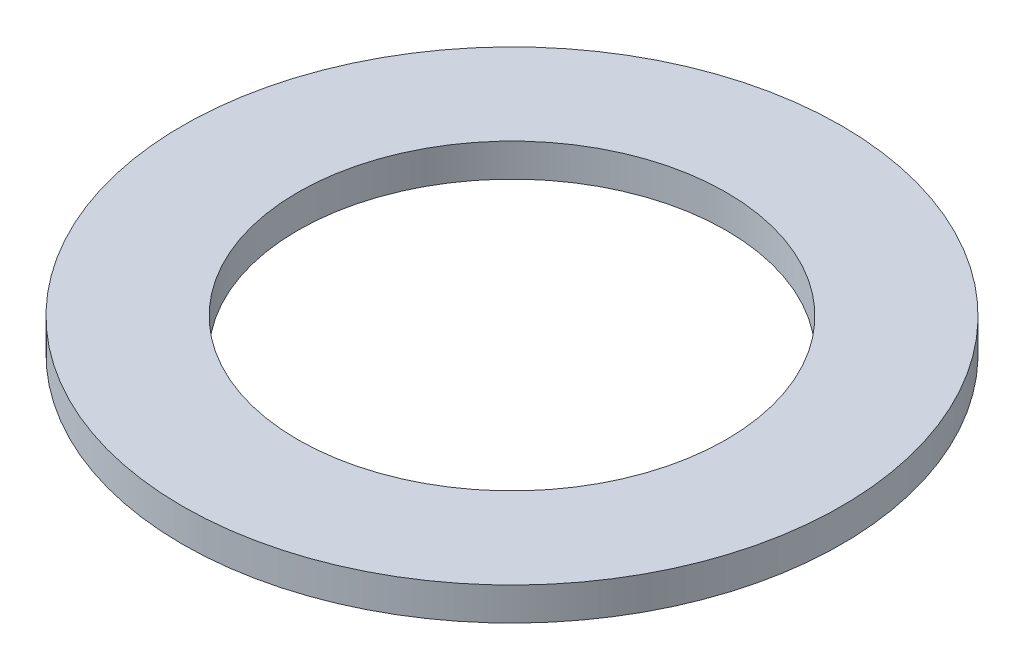
ISO-10303-21;
HEADER;
FILE_DESCRIPTION(('STEP AP214'),'2;1');
FILE_NAME('part.step','',(''),(''),'','','');
FILE_SCHEMA(('AUTOMOTIVE_DESIGN { 1 0 10303 214 1 1 1 1 }'));
ENDSEC;
DATA;
#1=APPLICATION_CONTEXT('core data for automotive mechanical design processes');
#2=APPLICATION_PROTOCOL_DEFINITION('international standard','automotive_design',2000,#1);
#3=PRODUCT_CONTEXT('',#1,'mechanical');
#4=PRODUCT('Part','Part','',(#3));
#5=PRODUCT_RELATED_PRODUCT_CATEGORY('part','',(#4));
#6=PRODUCT_DEFINITION_FORMATION('','',#4);
#7=PRODUCT_DEFINITION_CONTEXT('part definition',#1,'design');
#8=PRODUCT_DEFINITION('design','',#6,#7);
#9=PRODUCT_DEFINITION_SHAPE('','',#8);
#10=(LENGTH_UNIT() NAMED_UNIT(*) SI_UNIT(.MILLI.,.METRE.));
#11=(NAMED_UNIT(*) PLANE_ANGLE_UNIT() SI_UNIT($,.RADIAN.));
#12=(NAMED_UNIT(*) SI_UNIT($,.STERADIAN.) SOLID_ANGLE_UNIT());
#13=UNCERTAINTY_MEASURE_WITH_UNIT(LENGTH_MEASURE(1.E-05),#10,'distance_accuracy_value','');
#14=(GEOMETRIC_REPRESENTATION_CONTEXT(3) GLOBAL_UNCERTAINTY_ASSIGNED_CONTEXT((#13)) GLOBAL_UNIT_ASSIGNED_CONTEXT((#10,
#11,#12)) REPRESENTATION_CONTEXT('',''));
#15=CARTESIAN_POINT('',(0.,0.,0.));
#16=DIRECTION('',(0.,0.,1.));
#17=DIRECTION('',(1.,0.,0.));
#18=AXIS2_PLACEMENT_3D('',#15,#16,#17);
#19=CARTESIAN_POINT('',(0.,-0.5,0.));
#20=DIRECTION('',(0.,1.,0.));
#21=DIRECTION('',(0.,0.,1.));
#22=AXIS2_PLACEMENT_3D('',#19,#20,#21);
#23=CYLINDRICAL_SURFACE('',#22,5.);
#24=CARTESIAN_POINT('',(0.,-0.5,0.));
#25=DIRECTION('',(0.,1.,0.));
#26=DIRECTION('',(0.,0.,1.));
#27=AXIS2_PLACEMENT_3D('',#24,#25,#26);
#28=CIRCLE('',#27,5.);
#29=CARTESIAN_POINT('',(0.,-0.5,5.));
#30=VERTEX_POINT('',#29);
#31=EDGE_CURVE('E10',#30,#30,#28,.T.);
#32=ORIENTED_EDGE('',*,*,#31,.T.);
#33=EDGE_LOOP('',(#32));
#34=FACE_BOUND('',#33,.T.);
#35=CARTESIAN_POINT('',(0.,0.,0.));
#36=DIRECTION('',(0.,1.,0.));
#37=DIRECTION('',(0.,0.,1.));
#38=AXIS2_PLACEMENT_3D('',#35,#36,#37);
#39=CIRCLE('',#38,5.);
#40=CARTESIAN_POINT('',(0.,0.,5.));
#41=VERTEX_POINT('',#40);
#42=EDGE_CURVE('E46',#41,#41,#39,.T.);
#43=ORIENTED_EDGE('',*,*,#42,.F.);
#44=EDGE_LOOP('',(#43));
#45=FACE_BOUND('',#44,.T.);
#46=ADVANCED_FACE('F43',(#34,#45),#23,.T.);
#47=CARTESIAN_POINT('',(0.,-0.5,0.));
#48=DIRECTION('',(0.,1.,0.));
#49=DIRECTION('',(0.,0.,1.));
#50=AXIS2_PLACEMENT_3D('',#47,#48,#49);
#51=PLANE('',#50);
#52=CARTESIAN_POINT('',(0.,-0.5,0.));
#53=DIRECTION('',(0.,1.,0.));
#54=DIRECTION('',(0.,0.,1.));
#55=AXIS2_PLACEMENT_3D('',#52,#53,#54);
#56=CIRCLE('',#55,3.25);
#57=CARTESIAN_POINT('',(0.,-0.5,3.25));
#58=VERTEX_POINT('',#57);
#59=EDGE_CURVE('E53',#58,#58,#56,.T.);
#60=ORIENTED_EDGE('',*,*,#59,.T.);
#61=EDGE_LOOP('',(#60));
#62=FACE_BOUND('',#61,.T.);
#63=ORIENTED_EDGE('',*,*,#31,.F.);
#64=EDGE_LOOP('',(#63));
#65=FACE_BOUND('',#64,.T.);
#66=ADVANCED_FACE('F61',(#62,#65),#51,.F.);
#67=CARTESIAN_POINT('',(0.,0.,0.));
#68=DIRECTION('',(0.,1.,0.));
#69=DIRECTION('',(0.,0.,1.));
#70=AXIS2_PLACEMENT_3D('',#67,#68,#69);
#71=PLANE('',#70);
#72=CARTESIAN_POINT('',(0.,0.,0.));
#73=DIRECTION('',(0.,1.,0.));
#74=DIRECTION('',(0.,0.,1.));
#75=AXIS2_PLACEMENT_3D('',#72,#73,#74);
#76=CIRCLE('',#75,3.25);
#77=CARTESIAN_POINT('',(0.,0.,3.25));
#78=VERTEX_POINT('',#77);
#79=EDGE_CURVE('E55',#78,#78,#76,.T.);
#80=ORIENTED_EDGE('',*,*,#79,.F.);
#81=EDGE_LOOP('',(#80));
#82=FACE_BOUND('',#81,.T.);
#83=ORIENTED_EDGE('',*,*,#42,.T.);
#84=EDGE_LOOP('',(#83));
#85=FACE_BOUND('',#84,.T.);
#86=ADVANCED_FACE('F67',(#82,#85),#71,.T.);
#87=CARTESIAN_POINT('',(0.,-0.5,0.));
#88=DIRECTION('',(0.,1.,0.));
#89=DIRECTION('',(0.,0.,1.));
#90=AXIS2_PLACEMENT_3D('',#87,#88,#89);
#91=CYLINDRICAL_SURFACE('',#90,3.25);
#92=ORIENTED_EDGE('',*,*,#59,.F.);
#93=EDGE_LOOP('',(#92));
#94=FACE_BOUND('',#93,.T.);
#95=ORIENTED_EDGE('',*,*,#79,.T.);
#96=EDGE_LOOP('',(#95));
#97=FACE_BOUND('',#96,.T.);
#98=ADVANCED_FACE('F64',(#94,#97),#91,.F.);
#99=CLOSED_SHELL('',(#46,#66,#86,#98));
#100=MANIFOLD_SOLID_BREP('B2',#99);
#101=ADVANCED_BREP_SHAPE_REPRESENTATION('',(#18,#100),#14);
#102=SHAPE_DEFINITION_REPRESENTATION(#9,#101);
ENDSEC;
END-ISO-10303-21;
